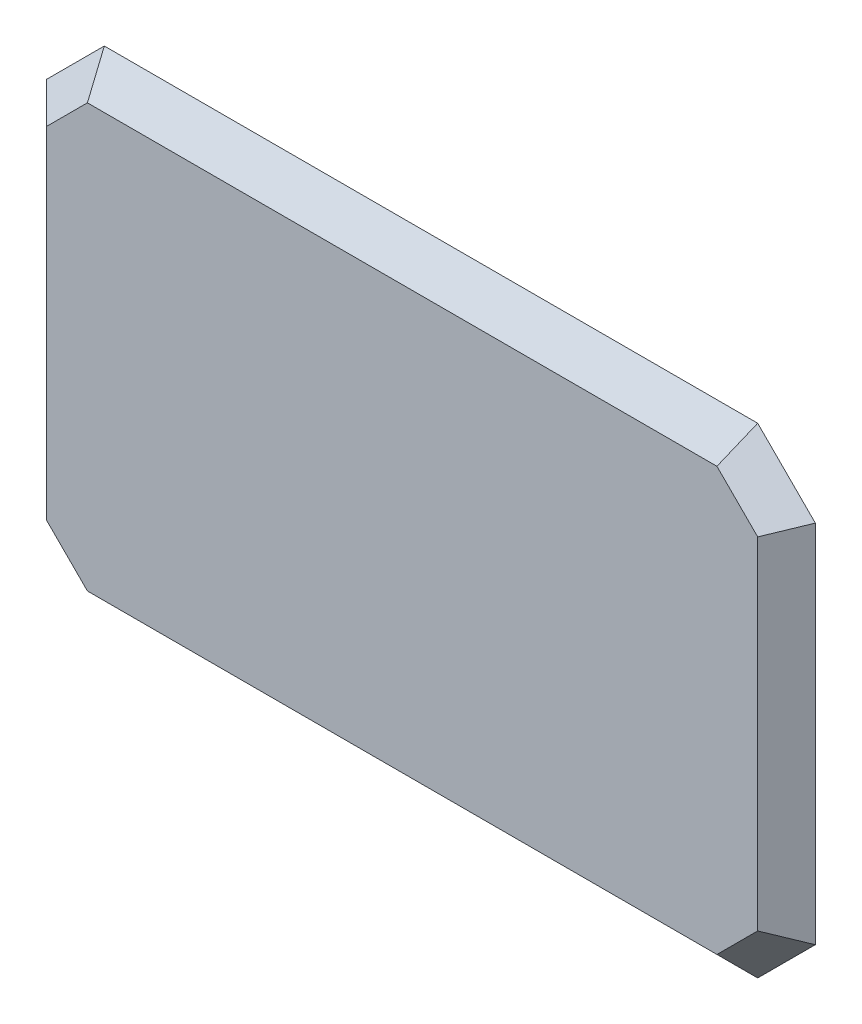
ISO-10303-21;
HEADER;
FILE_DESCRIPTION(('STEP AP214'),'2;1');
FILE_NAME('part.step','',(''),(''),'','','');
FILE_SCHEMA(('AUTOMOTIVE_DESIGN { 1 0 10303 214 1 1 1 1 }'));
ENDSEC;
DATA;
#1=APPLICATION_CONTEXT('core data for automotive mechanical design processes');
#2=APPLICATION_PROTOCOL_DEFINITION('international standard','automotive_design',2000,#1);
#3=PRODUCT_CONTEXT('',#1,'mechanical');
#4=PRODUCT('Part','Part','',(#3));
#5=PRODUCT_RELATED_PRODUCT_CATEGORY('part','',(#4));
#6=PRODUCT_DEFINITION_FORMATION('','',#4);
#7=PRODUCT_DEFINITION_CONTEXT('part definition',#1,'design');
#8=PRODUCT_DEFINITION('design','',#6,#7);
#9=PRODUCT_DEFINITION_SHAPE('','',#8);
#10=(LENGTH_UNIT() NAMED_UNIT(*) SI_UNIT(.MILLI.,.METRE.));
#11=(NAMED_UNIT(*) PLANE_ANGLE_UNIT() SI_UNIT($,.RADIAN.));
#12=(NAMED_UNIT(*) SI_UNIT($,.STERADIAN.) SOLID_ANGLE_UNIT());
#13=UNCERTAINTY_MEASURE_WITH_UNIT(LENGTH_MEASURE(1.E-05),#10,'distance_accuracy_value','');
#14=(GEOMETRIC_REPRESENTATION_CONTEXT(3) GLOBAL_UNCERTAINTY_ASSIGNED_CONTEXT((#13)) GLOBAL_UNIT_ASSIGNED_CONTEXT((#10,
#11,#12)) REPRESENTATION_CONTEXT('',''));
#15=CARTESIAN_POINT('',(0.,0.,0.));
#16=DIRECTION('',(0.,0.,1.));
#17=DIRECTION('',(1.,0.,0.));
#18=AXIS2_PLACEMENT_3D('',#15,#16,#17);
#19=CARTESIAN_POINT('',(-89.9999999999999,-38.,0.));
#20=DIRECTION('',(-0.500000000000002,-0.499999999999998,0.707106781186548));
#21=DIRECTION('',(0.816496580927725,0.,0.577350269189627));
#22=AXIS2_PLACEMENT_3D('',#19,#20,#21);
#23=PLANE('',#22);
#24=DIRECTION('',(0.707106781186544,-0.707106781186551,0.));
#25=VECTOR('',#24,1.);
#26=CARTESIAN_POINT('',(-89.9999999999999,-38.,0.));
#27=LINE('',#26,#25);
#28=CARTESIAN_POINT('',(-89.9999999999999,-38.,0.));
#29=VERTEX_POINT('',#28);
#30=CARTESIAN_POINT('',(-78.,-50.,0.));
#31=VERTEX_POINT('',#30);
#32=EDGE_CURVE('E109',#29,#31,#27,.T.);
#33=ORIENTED_EDGE('',*,*,#32,.T.);
#34=DIRECTION('',(-0.281084637714822,-0.678598344545847,-0.678598344545847));
#35=VECTOR('',#34,1.);
#36=CARTESIAN_POINT('',(-78.,-50.,0.));
#37=LINE('',#36,#35);
#38=CARTESIAN_POINT('',(-75.5147186257614,-44.,6.));
#39=VERTEX_POINT('',#38);
#40=EDGE_CURVE('E11',#39,#31,#37,.T.);
#41=ORIENTED_EDGE('',*,*,#40,.F.);
#42=DIRECTION('',(-0.707106781186544,0.707106781186551,0.));
#43=VECTOR('',#42,1.);
#44=CARTESIAN_POINT('',(-85.7573593128806,-33.7573593128807,6.));
#45=LINE('',#44,#43);
#46=CARTESIAN_POINT('',(-83.9999999999999,-35.5147186257614,6.));
#47=VERTEX_POINT('',#46);
#48=EDGE_CURVE('E134',#47,#39,#45,.F.);
#49=ORIENTED_EDGE('',*,*,#48,.F.);
#50=DIRECTION('',(-0.678598344545847,-0.281084637714819,-0.678598344545847));
#51=VECTOR('',#50,1.);
#52=CARTESIAN_POINT('',(-89.9999999999999,-38.,0.));
#53=LINE('',#52,#51);
#54=EDGE_CURVE('E121',#47,#29,#53,.T.);
#55=ORIENTED_EDGE('',*,*,#54,.T.);
#56=EDGE_LOOP('',(#33,#41,#49,#55));
#57=FACE_BOUND('',#56,.T.);
#58=ADVANCED_FACE('F39',(#57),#23,.T.);
#59=CARTESIAN_POINT('',(-78.,-50.,0.));
#60=DIRECTION('',(0.,-0.707106781186547,0.707106781186548));
#61=DIRECTION('',(0.,-0.707106781186548,-0.707106781186547));
#62=AXIS2_PLACEMENT_3D('',#59,#60,#61);
#63=PLANE('',#62);
#64=DIRECTION('',(1.,0.,0.));
#65=VECTOR('',#64,1.);
#66=CARTESIAN_POINT('',(-78.,-50.,0.));
#67=LINE('',#66,#65);
#68=CARTESIAN_POINT('',(58.,-50.,0.));
#69=VERTEX_POINT('',#68);
#70=EDGE_CURVE('E105',#31,#69,#67,.T.);
#71=ORIENTED_EDGE('',*,*,#70,.T.);
#72=DIRECTION('',(0.281084637714821,-0.678598344545847,-0.678598344545847));
#73=VECTOR('',#72,1.);
#74=CARTESIAN_POINT('',(58.,-50.,0.));
#75=LINE('',#74,#73);
#76=CARTESIAN_POINT('',(55.5147186257614,-44.,6.));
#77=VERTEX_POINT('',#76);
#78=EDGE_CURVE('E48',#77,#69,#75,.T.);
#79=ORIENTED_EDGE('',*,*,#78,.F.);
#80=DIRECTION('',(-1.,0.,0.));
#81=VECTOR('',#80,1.);
#82=CARTESIAN_POINT('',(-78.,-44.,6.));
#83=LINE('',#82,#81);
#84=EDGE_CURVE('E117',#39,#77,#83,.F.);
#85=ORIENTED_EDGE('',*,*,#84,.F.);
#86=ORIENTED_EDGE('',*,*,#40,.T.);
#87=EDGE_LOOP('',(#71,#79,#85,#86));
#88=FACE_BOUND('',#87,.T.);
#89=ADVANCED_FACE('F41',(#88),#63,.T.);
#90=CARTESIAN_POINT('',(58.,-50.,0.));
#91=DIRECTION('',(0.500000000000001,-0.499999999999999,0.707106781186548));
#92=DIRECTION('',(0.816496580927726,0.,-0.577350269189626));
#93=AXIS2_PLACEMENT_3D('',#90,#91,#92);
#94=PLANE('',#93);
#95=DIRECTION('',(0.707106781186546,0.707106781186548,0.));
#96=VECTOR('',#95,1.);
#97=CARTESIAN_POINT('',(58.,-50.,0.));
#98=LINE('',#97,#96);
#99=CARTESIAN_POINT('',(70.,-38.,0.));
#100=VERTEX_POINT('',#99);
#101=EDGE_CURVE('E111',#69,#100,#98,.T.);
#102=ORIENTED_EDGE('',*,*,#101,.T.);
#103=DIRECTION('',(0.678598344545847,-0.28108463771482,-0.678598344545847));
#104=VECTOR('',#103,1.);
#105=CARTESIAN_POINT('',(70.,-38.,0.));
#106=LINE('',#105,#104);
#107=CARTESIAN_POINT('',(64.,-35.5147186257614,6.));
#108=VERTEX_POINT('',#107);
#109=EDGE_CURVE('E149',#108,#100,#106,.T.);
#110=ORIENTED_EDGE('',*,*,#109,.F.);
#111=DIRECTION('',(-0.707106781186547,-0.707106781186549,0.));
#112=VECTOR('',#111,1.);
#113=CARTESIAN_POINT('',(53.7573593128807,-45.7573593128807,6.));
#114=LINE('',#113,#112);
#115=EDGE_CURVE('E155',#77,#108,#114,.F.);
#116=ORIENTED_EDGE('',*,*,#115,.F.);
#117=ORIENTED_EDGE('',*,*,#78,.T.);
#118=EDGE_LOOP('',(#102,#110,#116,#117));
#119=FACE_BOUND('',#118,.T.);
#120=ADVANCED_FACE('F178',(#119),#94,.T.);
#121=CARTESIAN_POINT('',(70.,-38.,0.));
#122=DIRECTION('',(0.707106781186547,0.,0.707106781186548));
#123=DIRECTION('',(0.707106781186548,0.,-0.707106781186547));
#124=AXIS2_PLACEMENT_3D('',#121,#122,#123);
#125=PLANE('',#124);
#126=DIRECTION('',(0.,1.,0.));
#127=VECTOR('',#126,1.);
#128=CARTESIAN_POINT('',(70.,-38.,0.));
#129=LINE('',#128,#127);
#130=CARTESIAN_POINT('',(70.,38.,0.));
#131=VERTEX_POINT('',#130);
#132=EDGE_CURVE('E125',#100,#131,#129,.T.);
#133=ORIENTED_EDGE('',*,*,#132,.T.);
#134=DIRECTION('',(0.678598344545847,0.281084637714821,-0.678598344545847));
#135=VECTOR('',#134,1.);
#136=CARTESIAN_POINT('',(70.,38.,0.));
#137=LINE('',#136,#135);
#138=CARTESIAN_POINT('',(64.,35.5147186257614,6.));
#139=VERTEX_POINT('',#138);
#140=EDGE_CURVE('E146',#139,#131,#137,.T.);
#141=ORIENTED_EDGE('',*,*,#140,.F.);
#142=DIRECTION('',(0.,-1.,0.));
#143=VECTOR('',#142,1.);
#144=CARTESIAN_POINT('',(64.,-38.,6.));
#145=LINE('',#144,#143);
#146=EDGE_CURVE('E157',#108,#139,#145,.F.);
#147=ORIENTED_EDGE('',*,*,#146,.F.);
#148=ORIENTED_EDGE('',*,*,#109,.T.);
#149=EDGE_LOOP('',(#133,#141,#147,#148));
#150=FACE_BOUND('',#149,.T.);
#151=ADVANCED_FACE('F182',(#150),#125,.T.);
#152=CARTESIAN_POINT('',(70.,38.,0.));
#153=DIRECTION('',(0.499999999999999,0.500000000000001,0.707106781186548));
#154=DIRECTION('',(0.,-0.816496580927726,0.577350269189626));
#155=AXIS2_PLACEMENT_3D('',#152,#153,#154);
#156=PLANE('',#155);
#157=DIRECTION('',(-0.707106781186549,0.707106781186546,0.));
#158=VECTOR('',#157,1.);
#159=CARTESIAN_POINT('',(70.,38.,0.));
#160=LINE('',#159,#158);
#161=CARTESIAN_POINT('',(58.,50.,0.));
#162=VERTEX_POINT('',#161);
#163=EDGE_CURVE('E127',#131,#162,#160,.T.);
#164=ORIENTED_EDGE('',*,*,#163,.T.);
#165=DIRECTION('',(0.28108463771482,0.678598344545847,-0.678598344545847));
#166=VECTOR('',#165,1.);
#167=CARTESIAN_POINT('',(58.,50.,0.));
#168=LINE('',#167,#166);
#169=CARTESIAN_POINT('',(55.5147186257614,44.,6.));
#170=VERTEX_POINT('',#169);
#171=EDGE_CURVE('E143',#170,#162,#168,.T.);
#172=ORIENTED_EDGE('',*,*,#171,.F.);
#173=DIRECTION('',(0.707106781186549,-0.707106781186546,0.));
#174=VECTOR('',#173,1.);
#175=CARTESIAN_POINT('',(65.7573593128807,33.7573593128807,6.));
#176=LINE('',#175,#174);
#177=EDGE_CURVE('E159',#139,#170,#176,.F.);
#178=ORIENTED_EDGE('',*,*,#177,.F.);
#179=ORIENTED_EDGE('',*,*,#140,.T.);
#180=EDGE_LOOP('',(#164,#172,#178,#179));
#181=FACE_BOUND('',#180,.T.);
#182=ADVANCED_FACE('F185',(#181),#156,.T.);
#183=CARTESIAN_POINT('',(58.,50.,0.));
#184=DIRECTION('',(0.,0.707106781186547,0.707106781186548));
#185=DIRECTION('',(0.,-0.707106781186548,0.707106781186547));
#186=AXIS2_PLACEMENT_3D('',#183,#184,#185);
#187=PLANE('',#186);
#188=DIRECTION('',(-1.,0.,0.));
#189=VECTOR('',#188,1.);
#190=CARTESIAN_POINT('',(58.,50.,0.));
#191=LINE('',#190,#189);
#192=CARTESIAN_POINT('',(-78.,50.,0.));
#193=VERTEX_POINT('',#192);
#194=EDGE_CURVE('E129',#162,#193,#191,.T.);
#195=ORIENTED_EDGE('',*,*,#194,.T.);
#196=DIRECTION('',(-0.281084637714821,0.678598344545847,-0.678598344545847));
#197=VECTOR('',#196,1.);
#198=CARTESIAN_POINT('',(-78.,50.,0.));
#199=LINE('',#198,#197);
#200=CARTESIAN_POINT('',(-75.5147186257614,44.,6.));
#201=VERTEX_POINT('',#200);
#202=EDGE_CURVE('E140',#201,#193,#199,.T.);
#203=ORIENTED_EDGE('',*,*,#202,.F.);
#204=DIRECTION('',(1.,0.,0.));
#205=VECTOR('',#204,1.);
#206=CARTESIAN_POINT('',(58.,44.,6.));
#207=LINE('',#206,#205);
#208=EDGE_CURVE('E161',#170,#201,#207,.F.);
#209=ORIENTED_EDGE('',*,*,#208,.F.);
#210=ORIENTED_EDGE('',*,*,#171,.T.);
#211=EDGE_LOOP('',(#195,#203,#209,#210));
#212=FACE_BOUND('',#211,.T.);
#213=ADVANCED_FACE('F168',(#212),#187,.T.);
#214=CARTESIAN_POINT('',(-78.,50.,0.));
#215=DIRECTION('',(-0.500000000000001,0.499999999999999,0.707106781186548));
#216=DIRECTION('',(0.816496580927726,0.,0.577350269189626));
#217=AXIS2_PLACEMENT_3D('',#214,#215,#216);
#218=PLANE('',#217);
#219=DIRECTION('',(-0.707106781186547,-0.707106781186549,0.));
#220=VECTOR('',#219,1.);
#221=CARTESIAN_POINT('',(-78.,50.,0.));
#222=LINE('',#221,#220);
#223=CARTESIAN_POINT('',(-89.9999999999999,38.,0.));
#224=VERTEX_POINT('',#223);
#225=EDGE_CURVE('E131',#193,#224,#222,.T.);
#226=ORIENTED_EDGE('',*,*,#225,.T.);
#227=DIRECTION('',(-0.678598344545847,0.28108463771482,-0.678598344545847));
#228=VECTOR('',#227,1.);
#229=CARTESIAN_POINT('',(-89.9999999999999,38.,0.));
#230=LINE('',#229,#228);
#231=CARTESIAN_POINT('',(-83.9999999999999,35.5147186257614,6.));
#232=VERTEX_POINT('',#231);
#233=EDGE_CURVE('E137',#232,#224,#230,.T.);
#234=ORIENTED_EDGE('',*,*,#233,.F.);
#235=DIRECTION('',(0.707106781186547,0.707106781186548,0.));
#236=VECTOR('',#235,1.);
#237=CARTESIAN_POINT('',(-73.7573593128807,45.7573593128807,6.));
#238=LINE('',#237,#236);
#239=EDGE_CURVE('E60',#201,#232,#238,.F.);
#240=ORIENTED_EDGE('',*,*,#239,.F.);
#241=ORIENTED_EDGE('',*,*,#202,.T.);
#242=EDGE_LOOP('',(#226,#234,#240,#241));
#243=FACE_BOUND('',#242,.T.);
#244=ADVANCED_FACE('F172',(#243),#218,.T.);
#245=CARTESIAN_POINT('',(-89.9999999999999,38.,0.));
#246=DIRECTION('',(-0.707106781186547,0.,0.707106781186548));
#247=DIRECTION('',(0.707106781186548,0.,0.707106781186547));
#248=AXIS2_PLACEMENT_3D('',#245,#246,#247);
#249=PLANE('',#248);
#250=DIRECTION('',(0.,-1.,0.));
#251=VECTOR('',#250,1.);
#252=CARTESIAN_POINT('',(-89.9999999999999,38.,0.));
#253=LINE('',#252,#251);
#254=EDGE_CURVE('E133',#224,#29,#253,.T.);
#255=ORIENTED_EDGE('',*,*,#254,.T.);
#256=ORIENTED_EDGE('',*,*,#54,.F.);
#257=DIRECTION('',(0.,1.,0.));
#258=VECTOR('',#257,1.);
#259=CARTESIAN_POINT('',(-83.9999999999999,38.,6.));
#260=LINE('',#259,#258);
#261=EDGE_CURVE('E43',#232,#47,#260,.F.);
#262=ORIENTED_EDGE('',*,*,#261,.F.);
#263=ORIENTED_EDGE('',*,*,#233,.T.);
#264=EDGE_LOOP('',(#255,#256,#262,#263));
#265=FACE_BOUND('',#264,.T.);
#266=ADVANCED_FACE('F174',(#265),#249,.T.);
#267=CARTESIAN_POINT('',(0.,0.,6.));
#268=DIRECTION('',(0.,0.,1.));
#269=DIRECTION('',(1.,0.,0.));
#270=AXIS2_PLACEMENT_3D('',#267,#268,#269);
#271=PLANE('',#270);
#272=ORIENTED_EDGE('',*,*,#48,.T.);
#273=ORIENTED_EDGE('',*,*,#84,.T.);
#274=ORIENTED_EDGE('',*,*,#115,.T.);
#275=ORIENTED_EDGE('',*,*,#146,.T.);
#276=ORIENTED_EDGE('',*,*,#177,.T.);
#277=ORIENTED_EDGE('',*,*,#208,.T.);
#278=ORIENTED_EDGE('',*,*,#239,.T.);
#279=ORIENTED_EDGE('',*,*,#261,.T.);
#280=EDGE_LOOP('',(#272,#273,#274,#275,#276,#277,#278,#279));
#281=FACE_BOUND('',#280,.T.);
#282=ADVANCED_FACE('F164',(#281),#271,.T.);
#283=CARTESIAN_POINT('',(0.,0.,0.));
#284=DIRECTION('',(0.,0.,1.));
#285=DIRECTION('',(1.,0.,0.));
#286=AXIS2_PLACEMENT_3D('',#283,#284,#285);
#287=PLANE('',#286);
#288=ORIENTED_EDGE('',*,*,#32,.F.);
#289=ORIENTED_EDGE('',*,*,#254,.F.);
#290=ORIENTED_EDGE('',*,*,#225,.F.);
#291=ORIENTED_EDGE('',*,*,#194,.F.);
#292=ORIENTED_EDGE('',*,*,#163,.F.);
#293=ORIENTED_EDGE('',*,*,#132,.F.);
#294=ORIENTED_EDGE('',*,*,#101,.F.);
#295=ORIENTED_EDGE('',*,*,#70,.F.);
#296=EDGE_LOOP('',(#288,#289,#290,#291,#292,#293,#294,#295));
#297=FACE_BOUND('',#296,.T.);
#298=ADVANCED_FACE('F106',(#297),#287,.F.);
#299=CLOSED_SHELL('',(#58,#89,#120,#151,#182,#213,#244,#266,#282,#298));
#300=MANIFOLD_SOLID_BREP('B2',#299);
#301=ADVANCED_BREP_SHAPE_REPRESENTATION('',(#18,#300),#14);
#302=SHAPE_DEFINITION_REPRESENTATION(#9,#301);
ENDSEC;
END-ISO-10303-21;
